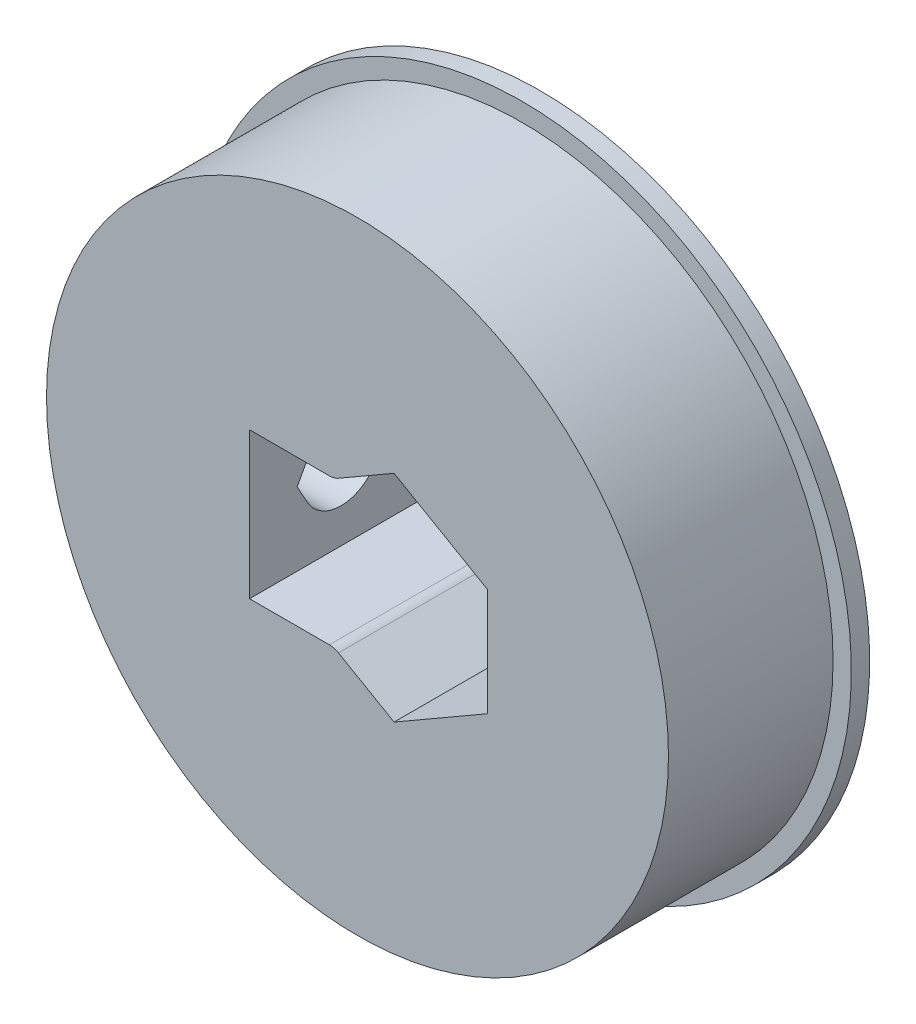
ISO-10303-21;
HEADER;
FILE_DESCRIPTION(('STEP AP214'),'2;1');
FILE_NAME('part.step','',(''),(''),'','','');
FILE_SCHEMA(('AUTOMOTIVE_DESIGN { 1 0 10303 214 1 1 1 1 }'));
ENDSEC;
DATA;
#1=APPLICATION_CONTEXT('core data for automotive mechanical design processes');
#2=APPLICATION_PROTOCOL_DEFINITION('international standard','automotive_design',2000,#1);
#3=PRODUCT_CONTEXT('',#1,'mechanical');
#4=PRODUCT('Part','Part','',(#3));
#5=PRODUCT_RELATED_PRODUCT_CATEGORY('part','',(#4));
#6=PRODUCT_DEFINITION_FORMATION('','',#4);
#7=PRODUCT_DEFINITION_CONTEXT('part definition',#1,'design');
#8=PRODUCT_DEFINITION('design','',#6,#7);
#9=PRODUCT_DEFINITION_SHAPE('','',#8);
#10=(LENGTH_UNIT() NAMED_UNIT(*) SI_UNIT(.MILLI.,.METRE.));
#11=(NAMED_UNIT(*) PLANE_ANGLE_UNIT() SI_UNIT($,.RADIAN.));
#12=(NAMED_UNIT(*) SI_UNIT($,.STERADIAN.) SOLID_ANGLE_UNIT());
#13=UNCERTAINTY_MEASURE_WITH_UNIT(LENGTH_MEASURE(1.E-05),#10,'distance_accuracy_value','');
#14=(GEOMETRIC_REPRESENTATION_CONTEXT(3) GLOBAL_UNCERTAINTY_ASSIGNED_CONTEXT((#13)) GLOBAL_UNIT_ASSIGNED_CONTEXT((#10,
#11,#12)) REPRESENTATION_CONTEXT('',''));
#15=CARTESIAN_POINT('',(0.,0.,0.));
#16=DIRECTION('',(0.,0.,1.));
#17=DIRECTION('',(1.,0.,0.));
#18=AXIS2_PLACEMENT_3D('',#15,#16,#17);
#19=CARTESIAN_POINT('',(-1.,0.,5.));
#20=DIRECTION('',(0.,0.,-1.));
#21=DIRECTION('',(-1.,0.,0.));
#22=AXIS2_PLACEMENT_3D('',#19,#20,#21);
#23=CYLINDRICAL_SURFACE('',#22,8.5);
#24=CARTESIAN_POINT('',(-1.,0.,5.));
#25=DIRECTION('',(0.,0.,1.));
#26=DIRECTION('',(1.,0.,0.));
#27=AXIS2_PLACEMENT_3D('',#24,#25,#26);
#28=CIRCLE('',#27,8.5);
#29=CARTESIAN_POINT('',(7.5,0.,5.));
#30=VERTEX_POINT('',#29);
#31=EDGE_CURVE('E309',#30,#30,#28,.T.);
#32=ORIENTED_EDGE('',*,*,#31,.F.);
#33=EDGE_LOOP('',(#32));
#34=FACE_BOUND('',#33,.T.);
#35=CARTESIAN_POINT('',(-1.,0.,1.3));
#36=DIRECTION('',(0.,0.484122918275927,0.875));
#37=DIRECTION('',(0.,0.875,-0.484122918275928));
#38=AXIS2_PLACEMENT_3D('',#35,#36,#37);
#39=ELLIPSE('',#38,9.71428571428572,8.5);
#40=CARTESIAN_POINT('',(-9.5,0.,1.3));
#41=VERTEX_POINT('',#40);
#42=CARTESIAN_POINT('',(-9.4847864771307,-0.508329064189726,1.58125));
#43=VERTEX_POINT('',#42);
#44=EDGE_CURVE('E204',#41,#43,#39,.T.);
#45=ORIENTED_EDGE('',*,*,#44,.F.);
#46=CARTESIAN_POINT('',(-1.,0.,1.3));
#47=DIRECTION('',(0.,0.484122918275927,-0.875));
#48=DIRECTION('',(0.,-0.875,-0.484122918275927));
#49=AXIS2_PLACEMENT_3D('',#46,#47,#48);
#50=ELLIPSE('',#49,9.71428571428572,8.5);
#51=CARTESIAN_POINT('',(-9.4847864771307,0.508329064189721,1.58125));
#52=VERTEX_POINT('',#51);
#53=EDGE_CURVE('E192',#41,#52,#50,.T.);
#54=ORIENTED_EDGE('',*,*,#53,.T.);
#55=CARTESIAN_POINT('',(-9.4847864771307,0.508329064189721,1.58125));
#56=CARTESIAN_POINT('',(-9.48323574889982,0.534220471547792,1.59557560273147));
#57=CARTESIAN_POINT('',(-9.48160239788813,0.559489731605946,1.61098674043252));
#58=CARTESIAN_POINT('',(-9.47821751741501,0.608632026250239,1.64387958024359));
#59=CARTESIAN_POINT('',(-9.4764659952054,0.632505146345776,1.6613611553467));
#60=CARTESIAN_POINT('',(-9.47110971218724,0.701739189101182,1.71670935831105));
#61=CARTESIAN_POINT('',(-9.46739840078255,0.744791770436927,1.75752216276972));
#62=CARTESIAN_POINT('',(-9.46011441256396,0.823426951914272,1.84580677945868));
#63=CARTESIAN_POINT('',(-9.4565417957666,0.859006346960635,1.8932814343181));
#64=CARTESIAN_POINT('',(-9.44993985578895,0.921689644474573,1.99356009210812));
#65=CARTESIAN_POINT('',(-9.44691041109765,0.948795443550254,2.04636289895667));
#66=CARTESIAN_POINT('',(-9.44174370321231,0.993718957594336,2.15574123956801));
#67=CARTESIAN_POINT('',(-9.43960527328735,1.01154882650044,2.21231172641289));
#68=CARTESIAN_POINT('',(-9.43646074646473,1.03744987980488,2.32768359808633));
#69=CARTESIAN_POINT('',(-9.43545476782663,1.04552004502391,2.38648521524459));
#70=CARTESIAN_POINT('',(-9.43469483729138,1.05163333467233,2.50420850125783));
#71=CARTESIAN_POINT('',(-9.43493232224319,1.04974503771451,2.5631265632005));
#72=CARTESIAN_POINT('',(-9.43661209500547,1.03615740231556,2.67979525706374));
#73=CARTESIAN_POINT('',(-9.43805423823087,1.02445924126989,2.7375460282326));
#74=CARTESIAN_POINT('',(-9.44197482427212,0.99163075137271,2.85014534583484));
#75=CARTESIAN_POINT('',(-9.44445135030286,0.970517863811937,2.90499905003813));
#76=CARTESIAN_POINT('',(-9.45016254588932,0.919461314866445,3.01041271747298));
#77=CARTESIAN_POINT('',(-9.45339749683242,0.889514374844131,3.06097107755741));
#78=CARTESIAN_POINT('',(-9.46028650390169,0.821419157442644,3.15669334096608));
#79=CARTESIAN_POINT('',(-9.46394321981619,0.78321733768192,3.20181888032724));
#80=CARTESIAN_POINT('',(-9.47124506539829,0.699819343125231,3.28499053187817));
#81=CARTESIAN_POINT('',(-9.47489020420562,0.654633620110309,3.3230470388609));
#82=CARTESIAN_POINT('',(-9.47945630976682,0.590824911694526,3.36821852461067));
#83=CARTESIAN_POINT('',(-9.48056507225811,0.574706013783247,3.37897057928987));
#84=CARTESIAN_POINT('',(-9.48272293928692,0.541922770266605,3.39955132478269));
#85=CARTESIAN_POINT('',(-9.48377214002211,0.525259376884247,3.40938152225283));
#86=CARTESIAN_POINT('',(-9.4847864771307,0.508329064189723,3.41875));
#87=B_SPLINE_CURVE_WITH_KNOTS('',3,(#55,#56,#57,#58,#59,#60,#61,#62,#63,#64,#65,#66,#67,#68,#69,
#70,#71,#72,#73,#74,#75,#76,#77,#78,#79,#80,#81,#82,#83,#84,#85,#86),.UNSPECIFIED.,.F.,.F.,(4,2,
2,2,2,2,2,2,2,2,2,2,2,2,2,4),(0.,0.088837681612939,0.177669916472964,0.355073278092299,
0.532552569691333,0.709992108383668,0.887198564756276,1.06442352471965,1.24042963148395,
1.41641461673883,1.5920749260345,1.76780051144732,1.94470205566992,2.1213413759701,
2.17954275377119,2.2376472877351),.UNSPECIFIED.);
#88=CARTESIAN_POINT('',(-9.4847864771307,0.508329064189721,3.41875));
#89=VERTEX_POINT('',#88);
#90=EDGE_CURVE('E203',#52,#89,#87,.T.);
#91=ORIENTED_EDGE('',*,*,#90,.T.);
#92=CARTESIAN_POINT('',(-1.,0.,3.7));
#93=DIRECTION('',(0.,-0.484122918275927,-0.875));
#94=DIRECTION('',(0.,0.875,-0.484122918275927));
#95=AXIS2_PLACEMENT_3D('',#92,#93,#94);
#96=ELLIPSE('',#95,9.71428571428572,8.5);
#97=CARTESIAN_POINT('',(-9.5,0.,3.7));
#98=VERTEX_POINT('',#97);
#99=EDGE_CURVE('E238',#98,#89,#96,.T.);
#100=ORIENTED_EDGE('',*,*,#99,.F.);
#101=CARTESIAN_POINT('',(-1.,0.,3.7));
#102=DIRECTION('',(0.,-0.484122918275927,0.875));
#103=DIRECTION('',(0.,-0.875,-0.484122918275928));
#104=AXIS2_PLACEMENT_3D('',#101,#102,#103);
#105=ELLIPSE('',#104,9.71428571428572,8.5);
#106=CARTESIAN_POINT('',(-9.4847864771307,-0.508329064189726,3.41875));
#107=VERTEX_POINT('',#106);
#108=EDGE_CURVE('E435',#98,#107,#105,.T.);
#109=ORIENTED_EDGE('',*,*,#108,.T.);
#110=CARTESIAN_POINT('',(-9.4847864771307,-0.508329064189726,3.41875));
#111=CARTESIAN_POINT('',(-9.48323574889982,-0.534220471547797,3.40442439726853));
#112=CARTESIAN_POINT('',(-9.48160239788813,-0.559489731605951,3.38901325956748));
#113=CARTESIAN_POINT('',(-9.47821751741502,-0.608632026250244,3.35612041975641));
#114=CARTESIAN_POINT('',(-9.4764659952054,-0.632505146345781,3.33863884465329));
#115=CARTESIAN_POINT('',(-9.47110971218725,-0.701739189101187,3.28329064168895));
#116=CARTESIAN_POINT('',(-9.46739840078255,-0.744791770436932,3.24247783723027));
#117=CARTESIAN_POINT('',(-9.46011441256396,-0.823426951914276,3.15419322054132));
#118=CARTESIAN_POINT('',(-9.4565417957666,-0.85900634696064,3.1067185656819));
#119=CARTESIAN_POINT('',(-9.44993985578895,-0.921689644474577,3.00643990789188));
#120=CARTESIAN_POINT('',(-9.44691041109765,-0.948795443550258,2.95363710104333));
#121=CARTESIAN_POINT('',(-9.44174370321231,-0.99371895759434,2.84425876043199));
#122=CARTESIAN_POINT('',(-9.43960527328735,-1.01154882650045,2.78768827358711));
#123=CARTESIAN_POINT('',(-9.43646074646473,-1.03744987980489,2.67231640191367));
#124=CARTESIAN_POINT('',(-9.43545476782663,-1.04552004502391,2.61351478475541));
#125=CARTESIAN_POINT('',(-9.43469483729138,-1.05163333467233,2.49579149874216));
#126=CARTESIAN_POINT('',(-9.43493232224319,-1.04974503771451,2.4368734367995));
#127=CARTESIAN_POINT('',(-9.43661209500547,-1.03615740231556,2.32020474293626));
#128=CARTESIAN_POINT('',(-9.43805423823087,-1.02445924126989,2.2624539717674));
#129=CARTESIAN_POINT('',(-9.44197482427212,-0.991630751372714,2.14985465416516));
#130=CARTESIAN_POINT('',(-9.44445135030286,-0.970517863811941,2.09500094996186));
#131=CARTESIAN_POINT('',(-9.45016254588932,-0.919461314866448,1.98958728252702));
#132=CARTESIAN_POINT('',(-9.45339749683242,-0.889514374844134,1.93902892244259));
#133=CARTESIAN_POINT('',(-9.46028650390169,-0.821419157442647,1.84330665903392));
#134=CARTESIAN_POINT('',(-9.46394321981619,-0.783217337681923,1.79818111967276));
#135=CARTESIAN_POINT('',(-9.47124506539829,-0.699819343125233,1.71500946812183));
#136=CARTESIAN_POINT('',(-9.47489020420562,-0.654633620110312,1.6769529611391));
#137=CARTESIAN_POINT('',(-9.47945630976682,-0.590824911694529,1.63178147538933));
#138=CARTESIAN_POINT('',(-9.48056507225811,-0.574706013783251,1.62102942071013));
#139=CARTESIAN_POINT('',(-9.48272293928692,-0.54192277026661,1.60044867521731));
#140=CARTESIAN_POINT('',(-9.4837721400221,-0.525259376884252,1.59061847774717));
#141=CARTESIAN_POINT('',(-9.4847864771307,-0.508329064189728,1.58125));
#142=B_SPLINE_CURVE_WITH_KNOTS('',3,(#110,#111,#112,#113,#114,#115,#116,#117,#118,#119,#120,
#121,#122,#123,#124,#125,#126,#127,#128,#129,#130,#131,#132,#133,#134,#135,#136,#137,#138,#139,
#140,#141),.UNSPECIFIED.,.F.,.F.,(4,2,2,2,2,2,2,2,2,2,2,2,2,2,2,4),(0.,0.088837681612939,
0.177669916472964,0.355073278092299,0.532552569691333,0.709992108383669,0.887198564756276,
1.06442352471965,1.24042963148395,1.41641461673883,1.5920749260345,1.76780051144733,
1.94470205566992,2.1213413759701,2.17954275377119,2.23764728773509),.UNSPECIFIED.);
#143=EDGE_CURVE('E216',#107,#43,#142,.T.);
#144=ORIENTED_EDGE('',*,*,#143,.T.);
#145=EDGE_LOOP('',(#45,#54,#91,#100,#109,#144));
#146=FACE_BOUND('',#145,.T.);
#147=CARTESIAN_POINT('',(-1.,0.,0.5));
#148=DIRECTION('',(0.,0.,-1.));
#149=DIRECTION('',(-1.,0.,0.));
#150=AXIS2_PLACEMENT_3D('',#147,#148,#149);
#151=CIRCLE('',#150,8.5);
#152=CARTESIAN_POINT('',(-9.5,0.,0.5));
#153=VERTEX_POINT('',#152);
#154=EDGE_CURVE('E11',#153,#153,#151,.T.);
#155=ORIENTED_EDGE('',*,*,#154,.F.);
#156=EDGE_LOOP('',(#155));
#157=FACE_BOUND('',#156,.T.);
#158=ADVANCED_FACE('F45',(#34,#146,#157),#23,.T.);
#159=CARTESIAN_POINT('',(-1.,0.,5.));
#160=DIRECTION('',(0.,0.,1.));
#161=DIRECTION('',(1.,0.,0.));
#162=AXIS2_PLACEMENT_3D('',#159,#160,#161);
#163=PLANE('',#162);
#164=ORIENTED_EDGE('',*,*,#31,.T.);
#165=EDGE_LOOP('',(#164));
#166=FACE_BOUND('',#165,.T.);
#167=DIRECTION('',(0.866025403784439,-0.5,0.));
#168=VECTOR('',#167,1.);
#169=CARTESIAN_POINT('',(-2.55,-1.47224318643355,5.));
#170=LINE('',#169,#168);
#171=CARTESIAN_POINT('',(-1.5198729810778,-2.06698729810778,5.));
#172=VERTEX_POINT('',#171);
#173=CARTESIAN_POINT('',(0.,-2.94448637286709,5.));
#174=VERTEX_POINT('',#173);
#175=EDGE_CURVE('E375',#172,#174,#170,.T.);
#176=ORIENTED_EDGE('',*,*,#175,.F.);
#177=CARTESIAN_POINT('',(-1.7698729810778,-2.5,5.));
#178=DIRECTION('',(0.,0.,1.));
#179=DIRECTION('',(1.,0.,0.));
#180=AXIS2_PLACEMENT_3D('',#177,#178,#179);
#181=CIRCLE('',#180,0.5);
#182=CARTESIAN_POINT('',(-1.7698729810778,-2.,5.));
#183=VERTEX_POINT('',#182);
#184=EDGE_CURVE('E328',#172,#183,#181,.T.);
#185=ORIENTED_EDGE('',*,*,#184,.T.);
#186=DIRECTION('',(-1.,0.,0.));
#187=VECTOR('',#186,1.);
#188=CARTESIAN_POINT('',(-1.15,-2.,5.));
#189=LINE('',#188,#187);
#190=CARTESIAN_POINT('',(-3.95,-2.,5.));
#191=VERTEX_POINT('',#190);
#192=EDGE_CURVE('E408',#183,#191,#189,.T.);
#193=ORIENTED_EDGE('',*,*,#192,.T.);
#194=DIRECTION('',(0.,-1.,0.));
#195=VECTOR('',#194,1.);
#196=CARTESIAN_POINT('',(-3.95,-2.,5.));
#197=LINE('',#196,#195);
#198=CARTESIAN_POINT('',(-3.95,2.,5.));
#199=VERTEX_POINT('',#198);
#200=EDGE_CURVE('E360',#199,#191,#197,.T.);
#201=ORIENTED_EDGE('',*,*,#200,.F.);
#202=DIRECTION('',(-1.,0.,0.));
#203=VECTOR('',#202,1.);
#204=CARTESIAN_POINT('',(-1.15,2.,5.));
#205=LINE('',#204,#203);
#206=CARTESIAN_POINT('',(-1.76987298107781,2.,5.));
#207=VERTEX_POINT('',#206);
#208=EDGE_CURVE('E349',#207,#199,#205,.T.);
#209=ORIENTED_EDGE('',*,*,#208,.F.);
#210=CARTESIAN_POINT('',(-1.76987298107781,2.5,5.));
#211=DIRECTION('',(0.,0.,1.));
#212=DIRECTION('',(1.,0.,0.));
#213=AXIS2_PLACEMENT_3D('',#210,#211,#212);
#214=CIRCLE('',#213,0.5);
#215=CARTESIAN_POINT('',(-1.51987298107781,2.06698729810778,5.));
#216=VERTEX_POINT('',#215);
#217=EDGE_CURVE('E318',#207,#216,#214,.T.);
#218=ORIENTED_EDGE('',*,*,#217,.T.);
#219=DIRECTION('',(-0.866025403784439,-0.5,0.));
#220=VECTOR('',#219,1.);
#221=CARTESIAN_POINT('',(0.,2.94448637286709,5.));
#222=LINE('',#221,#220);
#223=CARTESIAN_POINT('',(0.,2.94448637286709,5.));
#224=VERTEX_POINT('',#223);
#225=EDGE_CURVE('E370',#224,#216,#222,.T.);
#226=ORIENTED_EDGE('',*,*,#225,.F.);
#227=DIRECTION('',(-0.866025403784439,0.5,0.));
#228=VECTOR('',#227,1.);
#229=CARTESIAN_POINT('',(2.55,1.47224318643355,5.));
#230=LINE('',#229,#228);
#231=CARTESIAN_POINT('',(2.55,1.47224318643355,5.));
#232=VERTEX_POINT('',#231);
#233=EDGE_CURVE('E412',#232,#224,#230,.T.);
#234=ORIENTED_EDGE('',*,*,#233,.F.);
#235=DIRECTION('',(0.,1.,0.));
#236=VECTOR('',#235,1.);
#237=CARTESIAN_POINT('',(2.55,-1.47224318643355,5.));
#238=LINE('',#237,#236);
#239=CARTESIAN_POINT('',(2.55,-1.47224318643355,5.));
#240=VERTEX_POINT('',#239);
#241=EDGE_CURVE('E415',#240,#232,#238,.T.);
#242=ORIENTED_EDGE('',*,*,#241,.F.);
#243=DIRECTION('',(0.866025403784439,0.5,0.));
#244=VECTOR('',#243,1.);
#245=CARTESIAN_POINT('',(0.,-2.94448637286709,5.));
#246=LINE('',#245,#244);
#247=EDGE_CURVE('E378',#174,#240,#246,.T.);
#248=ORIENTED_EDGE('',*,*,#247,.F.);
#249=EDGE_LOOP('',(#176,#185,#193,#201,#209,#218,#226,#234,#242,#248));
#250=FACE_BOUND('',#249,.T.);
#251=ADVANCED_FACE('F295',(#166,#250),#163,.T.);
#252=CARTESIAN_POINT('',(-1.,0.,0.));
#253=DIRECTION('',(0.,0.,1.));
#254=DIRECTION('',(1.,0.,0.));
#255=AXIS2_PLACEMENT_3D('',#252,#253,#254);
#256=PLANE('',#255);
#257=DIRECTION('',(-1.,0.,0.));
#258=VECTOR('',#257,1.);
#259=CARTESIAN_POINT('',(-1.15,-2.,0.));
#260=LINE('',#259,#258);
#261=CARTESIAN_POINT('',(-1.7698729810778,-2.,0.));
#262=VERTEX_POINT('',#261);
#263=CARTESIAN_POINT('',(-3.95,-2.,0.));
#264=VERTEX_POINT('',#263);
#265=EDGE_CURVE('E420',#262,#264,#260,.T.);
#266=ORIENTED_EDGE('',*,*,#265,.F.);
#267=CARTESIAN_POINT('',(-1.7698729810778,-2.5,0.));
#268=DIRECTION('',(0.,0.,1.));
#269=DIRECTION('',(1.,0.,0.));
#270=AXIS2_PLACEMENT_3D('',#267,#268,#269);
#271=CIRCLE('',#270,0.5);
#272=CARTESIAN_POINT('',(-1.5198729810778,-2.06698729810778,0.));
#273=VERTEX_POINT('',#272);
#274=EDGE_CURVE('E337',#262,#273,#271,.F.);
#275=ORIENTED_EDGE('',*,*,#274,.T.);
#276=DIRECTION('',(0.866025403784439,-0.5,0.));
#277=VECTOR('',#276,1.);
#278=CARTESIAN_POINT('',(-2.55,-1.47224318643355,0.));
#279=LINE('',#278,#277);
#280=CARTESIAN_POINT('',(0.,-2.94448637286709,0.));
#281=VERTEX_POINT('',#280);
#282=EDGE_CURVE('E404',#273,#281,#279,.T.);
#283=ORIENTED_EDGE('',*,*,#282,.T.);
#284=DIRECTION('',(0.866025403784439,0.5,0.));
#285=VECTOR('',#284,1.);
#286=CARTESIAN_POINT('',(0.,-2.94448637286709,0.));
#287=LINE('',#286,#285);
#288=CARTESIAN_POINT('',(2.55,-1.47224318643355,0.));
#289=VERTEX_POINT('',#288);
#290=EDGE_CURVE('E398',#281,#289,#287,.T.);
#291=ORIENTED_EDGE('',*,*,#290,.T.);
#292=DIRECTION('',(0.,1.,0.));
#293=VECTOR('',#292,1.);
#294=CARTESIAN_POINT('',(2.55,-1.47224318643355,0.));
#295=LINE('',#294,#293);
#296=CARTESIAN_POINT('',(2.55,1.47224318643355,0.));
#297=VERTEX_POINT('',#296);
#298=EDGE_CURVE('E381',#289,#297,#295,.T.);
#299=ORIENTED_EDGE('',*,*,#298,.T.);
#300=DIRECTION('',(-0.866025403784439,0.5,0.));
#301=VECTOR('',#300,1.);
#302=CARTESIAN_POINT('',(2.55,1.47224318643355,0.));
#303=LINE('',#302,#301);
#304=CARTESIAN_POINT('',(0.,2.94448637286709,0.));
#305=VERTEX_POINT('',#304);
#306=EDGE_CURVE('E373',#297,#305,#303,.T.);
#307=ORIENTED_EDGE('',*,*,#306,.T.);
#308=DIRECTION('',(-0.866025403784439,-0.5,0.));
#309=VECTOR('',#308,1.);
#310=CARTESIAN_POINT('',(0.,2.94448637286709,0.));
#311=LINE('',#310,#309);
#312=CARTESIAN_POINT('',(-1.51987298107781,2.06698729810778,0.));
#313=VERTEX_POINT('',#312);
#314=EDGE_CURVE('E368',#305,#313,#311,.T.);
#315=ORIENTED_EDGE('',*,*,#314,.T.);
#316=CARTESIAN_POINT('',(-1.76987298107781,2.5,0.));
#317=DIRECTION('',(0.,0.,1.));
#318=DIRECTION('',(1.,0.,0.));
#319=AXIS2_PLACEMENT_3D('',#316,#317,#318);
#320=CIRCLE('',#319,0.5);
#321=CARTESIAN_POINT('',(-1.76987298107781,2.,0.));
#322=VERTEX_POINT('',#321);
#323=EDGE_CURVE('E334',#313,#322,#320,.F.);
#324=ORIENTED_EDGE('',*,*,#323,.T.);
#325=DIRECTION('',(-1.,0.,0.));
#326=VECTOR('',#325,1.);
#327=CARTESIAN_POINT('',(-1.15,2.,0.));
#328=LINE('',#327,#326);
#329=CARTESIAN_POINT('',(-3.95,2.,0.));
#330=VERTEX_POINT('',#329);
#331=EDGE_CURVE('E351',#322,#330,#328,.T.);
#332=ORIENTED_EDGE('',*,*,#331,.T.);
#333=DIRECTION('',(0.,1.,0.));
#334=VECTOR('',#333,1.);
#335=CARTESIAN_POINT('',(-3.95,-2.,0.));
#336=LINE('',#335,#334);
#337=EDGE_CURVE('E427',#264,#330,#336,.T.);
#338=ORIENTED_EDGE('',*,*,#337,.F.);
#339=EDGE_LOOP('',(#266,#275,#283,#291,#299,#307,#315,#324,#332,#338));
#340=FACE_BOUND('',#339,.T.);
#341=CARTESIAN_POINT('',(-1.,0.,0.));
#342=DIRECTION('',(0.,0.,-1.));
#343=DIRECTION('',(-1.,0.,0.));
#344=AXIS2_PLACEMENT_3D('',#341,#342,#343);
#345=CIRCLE('',#344,9.);
#346=CARTESIAN_POINT('',(-9.99999999999999,0.,0.));
#347=VERTEX_POINT('',#346);
#348=EDGE_CURVE('E474',#347,#347,#345,.T.);
#349=ORIENTED_EDGE('',*,*,#348,.T.);
#350=EDGE_LOOP('',(#349));
#351=FACE_BOUND('',#350,.T.);
#352=ADVANCED_FACE('F293',(#340,#351),#256,.F.);
#353=CARTESIAN_POINT('',(-2.55,-1.47224318643355,5.));
#354=DIRECTION('',(0.5,0.866025403784439,0.));
#355=DIRECTION('',(-0.866025403784439,0.5,0.));
#356=AXIS2_PLACEMENT_3D('',#353,#354,#355);
#357=PLANE('',#356);
#358=ORIENTED_EDGE('',*,*,#282,.F.);
#359=DIRECTION('',(0.,0.,1.));
#360=VECTOR('',#359,1.);
#361=CARTESIAN_POINT('',(-1.5198729810778,-2.06698729810778,5.));
#362=LINE('',#361,#360);
#363=EDGE_CURVE('E311',#273,#172,#362,.T.);
#364=ORIENTED_EDGE('',*,*,#363,.T.);
#365=ORIENTED_EDGE('',*,*,#175,.T.);
#366=DIRECTION('',(0.,0.,-1.));
#367=VECTOR('',#366,1.);
#368=CARTESIAN_POINT('',(0.,-2.94448637286709,5.));
#369=LINE('',#368,#367);
#370=EDGE_CURVE('E312',#174,#281,#369,.T.);
#371=ORIENTED_EDGE('',*,*,#370,.T.);
#372=EDGE_LOOP('',(#358,#364,#365,#371));
#373=FACE_BOUND('',#372,.T.);
#374=ADVANCED_FACE('F279',(#373),#357,.T.);
#375=CARTESIAN_POINT('',(0.,2.94448637286709,5.));
#376=DIRECTION('',(0.5,-0.866025403784439,0.));
#377=DIRECTION('',(0.866025403784439,0.5,0.));
#378=AXIS2_PLACEMENT_3D('',#375,#376,#377);
#379=PLANE('',#378);
#380=ORIENTED_EDGE('',*,*,#225,.T.);
#381=DIRECTION('',(0.,0.,-1.));
#382=VECTOR('',#381,1.);
#383=CARTESIAN_POINT('',(-1.51987298107781,2.06698729810778,5.));
#384=LINE('',#383,#382);
#385=EDGE_CURVE('E340',#216,#313,#384,.T.);
#386=ORIENTED_EDGE('',*,*,#385,.T.);
#387=ORIENTED_EDGE('',*,*,#314,.F.);
#388=DIRECTION('',(0.,0.,-1.));
#389=VECTOR('',#388,1.);
#390=CARTESIAN_POINT('',(0.,2.94448637286709,5.));
#391=LINE('',#390,#389);
#392=EDGE_CURVE('E385',#224,#305,#391,.T.);
#393=ORIENTED_EDGE('',*,*,#392,.F.);
#394=EDGE_LOOP('',(#380,#386,#387,#393));
#395=FACE_BOUND('',#394,.T.);
#396=ADVANCED_FACE('F275',(#395),#379,.T.);
#397=CARTESIAN_POINT('',(0.,-2.94448637286709,5.));
#398=DIRECTION('',(-0.5,0.866025403784439,0.));
#399=DIRECTION('',(-0.866025403784439,-0.5,0.));
#400=AXIS2_PLACEMENT_3D('',#397,#398,#399);
#401=PLANE('',#400);
#402=ORIENTED_EDGE('',*,*,#290,.F.);
#403=ORIENTED_EDGE('',*,*,#370,.F.);
#404=ORIENTED_EDGE('',*,*,#247,.T.);
#405=DIRECTION('',(0.,0.,-1.));
#406=VECTOR('',#405,1.);
#407=CARTESIAN_POINT('',(2.55,-1.47224318643355,5.));
#408=LINE('',#407,#406);
#409=EDGE_CURVE('E322',#240,#289,#408,.T.);
#410=ORIENTED_EDGE('',*,*,#409,.T.);
#411=EDGE_LOOP('',(#402,#403,#404,#410));
#412=FACE_BOUND('',#411,.T.);
#413=ADVANCED_FACE('F278',(#412),#401,.T.);
#414=CARTESIAN_POINT('',(2.55,-1.47224318643355,5.));
#415=DIRECTION('',(-1.,0.,0.));
#416=DIRECTION('',(0.,0.,1.));
#417=AXIS2_PLACEMENT_3D('',#414,#415,#416);
#418=PLANE('',#417);
#419=ORIENTED_EDGE('',*,*,#298,.F.);
#420=ORIENTED_EDGE('',*,*,#409,.F.);
#421=ORIENTED_EDGE('',*,*,#241,.T.);
#422=DIRECTION('',(0.,0.,-1.));
#423=VECTOR('',#422,1.);
#424=CARTESIAN_POINT('',(2.55,1.47224318643355,5.));
#425=LINE('',#424,#423);
#426=EDGE_CURVE('E388',#232,#297,#425,.T.);
#427=ORIENTED_EDGE('',*,*,#426,.T.);
#428=EDGE_LOOP('',(#419,#420,#421,#427));
#429=FACE_BOUND('',#428,.T.);
#430=ADVANCED_FACE('F283',(#429),#418,.T.);
#431=CARTESIAN_POINT('',(2.55,1.47224318643355,5.));
#432=DIRECTION('',(-0.5,-0.866025403784439,0.));
#433=DIRECTION('',(0.866025403784439,-0.5,0.));
#434=AXIS2_PLACEMENT_3D('',#431,#432,#433);
#435=PLANE('',#434);
#436=ORIENTED_EDGE('',*,*,#306,.F.);
#437=ORIENTED_EDGE('',*,*,#426,.F.);
#438=ORIENTED_EDGE('',*,*,#233,.T.);
#439=ORIENTED_EDGE('',*,*,#392,.T.);
#440=EDGE_LOOP('',(#436,#437,#438,#439));
#441=FACE_BOUND('',#440,.T.);
#442=ADVANCED_FACE('F273',(#441),#435,.T.);
#443=CARTESIAN_POINT('',(-1.15,-2.,0.));
#444=DIRECTION('',(0.,1.,0.));
#445=DIRECTION('',(-1.,0.,0.));
#446=AXIS2_PLACEMENT_3D('',#443,#444,#445);
#447=PLANE('',#446);
#448=ORIENTED_EDGE('',*,*,#192,.F.);
#449=DIRECTION('',(0.,0.,1.));
#450=VECTOR('',#449,1.);
#451=CARTESIAN_POINT('',(-1.7698729810778,-2.,0.));
#452=LINE('',#451,#450);
#453=EDGE_CURVE('E331',#183,#262,#452,.F.);
#454=ORIENTED_EDGE('',*,*,#453,.T.);
#455=ORIENTED_EDGE('',*,*,#265,.T.);
#456=DIRECTION('',(0.,0.,-1.));
#457=VECTOR('',#456,1.);
#458=CARTESIAN_POINT('',(-3.95,-2.,0.));
#459=LINE('',#458,#457);
#460=EDGE_CURVE('E430',#191,#264,#459,.T.);
#461=ORIENTED_EDGE('',*,*,#460,.F.);
#462=EDGE_LOOP('',(#448,#454,#455,#461));
#463=FACE_BOUND('',#462,.T.);
#464=ADVANCED_FACE('F269',(#463),#447,.T.);
#465=CARTESIAN_POINT('',(-1.15,2.,0.));
#466=DIRECTION('',(0.,-1.,0.));
#467=DIRECTION('',(1.,0.,0.));
#468=AXIS2_PLACEMENT_3D('',#465,#466,#467);
#469=PLANE('',#468);
#470=ORIENTED_EDGE('',*,*,#331,.F.);
#471=DIRECTION('',(0.,0.,-1.));
#472=VECTOR('',#471,1.);
#473=CARTESIAN_POINT('',(-1.76987298107781,2.,0.));
#474=LINE('',#473,#472);
#475=EDGE_CURVE('E54',#322,#207,#474,.F.);
#476=ORIENTED_EDGE('',*,*,#475,.T.);
#477=ORIENTED_EDGE('',*,*,#208,.T.);
#478=DIRECTION('',(0.,0.,1.));
#479=VECTOR('',#478,1.);
#480=CARTESIAN_POINT('',(-3.95,2.,0.));
#481=LINE('',#480,#479);
#482=EDGE_CURVE('E362',#330,#199,#481,.T.);
#483=ORIENTED_EDGE('',*,*,#482,.F.);
#484=EDGE_LOOP('',(#470,#476,#477,#483));
#485=FACE_BOUND('',#484,.T.);
#486=ADVANCED_FACE('F265',(#485),#469,.T.);
#487=CARTESIAN_POINT('',(-3.95,0.,0.));
#488=DIRECTION('',(1.,0.,0.));
#489=DIRECTION('',(0.,1.,0.));
#490=AXIS2_PLACEMENT_3D('',#487,#488,#489);
#491=PLANE('',#490);
#492=DIRECTION('',(0.,-0.875,-0.484122918275928));
#493=VECTOR('',#492,1.);
#494=CARTESIAN_POINT('',(-3.95,-1.56734794791832,2.8328125));
#495=LINE('',#494,#493);
#496=CARTESIAN_POINT('',(-3.95,0.,3.7));
#497=VERTEX_POINT('',#496);
#498=CARTESIAN_POINT('',(-3.95,-0.508329064189725,3.41875));
#499=VERTEX_POINT('',#498);
#500=EDGE_CURVE('E75',#497,#499,#495,.T.);
#501=ORIENTED_EDGE('',*,*,#500,.F.);
#502=DIRECTION('',(0.,0.875,-0.484122918275927));
#503=VECTOR('',#502,1.);
#504=CARTESIAN_POINT('',(-3.95,1.56734794791831,2.8328125));
#505=LINE('',#504,#503);
#506=CARTESIAN_POINT('',(-3.95,0.508329064189722,3.41875));
#507=VERTEX_POINT('',#506);
#508=EDGE_CURVE('E457',#497,#507,#505,.T.);
#509=ORIENTED_EDGE('',*,*,#508,.T.);
#510=CARTESIAN_POINT('',(-3.95,0.,2.5));
#511=DIRECTION('',(1.,0.,0.));
#512=DIRECTION('',(0.,1.,0.));
#513=AXIS2_PLACEMENT_3D('',#510,#511,#512);
#514=CIRCLE('',#513,1.05);
#515=CARTESIAN_POINT('',(-3.95,0.508329064189722,1.58125));
#516=VERTEX_POINT('',#515);
#517=EDGE_CURVE('E448',#516,#507,#514,.T.);
#518=ORIENTED_EDGE('',*,*,#517,.F.);
#519=DIRECTION('',(0.,0.875,0.484122918275927));
#520=VECTOR('',#519,1.);
#521=CARTESIAN_POINT('',(-3.95,-0.550689819538868,0.9953125));
#522=LINE('',#521,#520);
#523=CARTESIAN_POINT('',(-3.95,0.,1.3));
#524=VERTEX_POINT('',#523);
#525=EDGE_CURVE('E462',#524,#516,#522,.T.);
#526=ORIENTED_EDGE('',*,*,#525,.F.);
#527=DIRECTION('',(0.,-0.875,0.484122918275928));
#528=VECTOR('',#527,1.);
#529=CARTESIAN_POINT('',(-3.95,0.550689819538867,0.995312499999999));
#530=LINE('',#529,#528);
#531=CARTESIAN_POINT('',(-3.95,-0.508329064189725,1.58125));
#532=VERTEX_POINT('',#531);
#533=EDGE_CURVE('E210',#524,#532,#530,.T.);
#534=ORIENTED_EDGE('',*,*,#533,.T.);
#535=CARTESIAN_POINT('',(-3.95,0.,2.5));
#536=DIRECTION('',(1.,0.,0.));
#537=DIRECTION('',(0.,1.,0.));
#538=AXIS2_PLACEMENT_3D('',#535,#536,#537);
#539=CIRCLE('',#538,1.05);
#540=EDGE_CURVE('E469',#499,#532,#539,.T.);
#541=ORIENTED_EDGE('',*,*,#540,.F.);
#542=EDGE_LOOP('',(#501,#509,#518,#526,#534,#541));
#543=FACE_BOUND('',#542,.T.);
#544=ORIENTED_EDGE('',*,*,#200,.T.);
#545=ORIENTED_EDGE('',*,*,#460,.T.);
#546=ORIENTED_EDGE('',*,*,#337,.T.);
#547=ORIENTED_EDGE('',*,*,#482,.T.);
#548=EDGE_LOOP('',(#544,#545,#546,#547));
#549=FACE_BOUND('',#548,.T.);
#550=ADVANCED_FACE('F261',(#543,#549),#491,.T.);
#551=CARTESIAN_POINT('',(-1.7698729810778,-2.5,5.));
#552=DIRECTION('',(0.,0.,1.));
#553=DIRECTION('',(1.,0.,0.));
#554=AXIS2_PLACEMENT_3D('',#551,#552,#553);
#555=CYLINDRICAL_SURFACE('',#554,0.5);
#556=ORIENTED_EDGE('',*,*,#274,.F.);
#557=ORIENTED_EDGE('',*,*,#453,.F.);
#558=ORIENTED_EDGE('',*,*,#184,.F.);
#559=ORIENTED_EDGE('',*,*,#363,.F.);
#560=EDGE_LOOP('',(#556,#557,#558,#559));
#561=FACE_BOUND('',#560,.T.);
#562=ADVANCED_FACE('F264',(#561),#555,.T.);
#563=CARTESIAN_POINT('',(-1.76987298107781,2.5,5.));
#564=DIRECTION('',(0.,0.,-1.));
#565=DIRECTION('',(-1.,0.,0.));
#566=AXIS2_PLACEMENT_3D('',#563,#564,#565);
#567=CYLINDRICAL_SURFACE('',#566,0.5);
#568=ORIENTED_EDGE('',*,*,#217,.F.);
#569=ORIENTED_EDGE('',*,*,#475,.F.);
#570=ORIENTED_EDGE('',*,*,#323,.F.);
#571=ORIENTED_EDGE('',*,*,#385,.F.);
#572=EDGE_LOOP('',(#568,#569,#570,#571));
#573=FACE_BOUND('',#572,.T.);
#574=ADVANCED_FACE('F47',(#573),#567,.T.);
#575=CARTESIAN_POINT('',(-9.5,-1.56734794791832,2.8328125));
#576=DIRECTION('',(0.,-0.484122918275927,0.875));
#577=DIRECTION('',(0.,-0.875,-0.484122918275928));
#578=AXIS2_PLACEMENT_3D('',#575,#576,#577);
#579=PLANE('',#578);
#580=DIRECTION('',(1.,0.,0.));
#581=VECTOR('',#580,1.);
#582=CARTESIAN_POINT('',(-9.5,0.,3.7));
#583=LINE('',#582,#581);
#584=EDGE_CURVE('E222',#98,#497,#583,.T.);
#585=ORIENTED_EDGE('',*,*,#584,.T.);
#586=ORIENTED_EDGE('',*,*,#500,.T.);
#587=DIRECTION('',(1.,0.,0.));
#588=VECTOR('',#587,1.);
#589=CARTESIAN_POINT('',(-9.5,-0.508329064189726,3.41875));
#590=LINE('',#589,#588);
#591=EDGE_CURVE('E456',#107,#499,#590,.T.);
#592=ORIENTED_EDGE('',*,*,#591,.F.);
#593=ORIENTED_EDGE('',*,*,#108,.F.);
#594=EDGE_LOOP('',(#585,#586,#592,#593));
#595=FACE_BOUND('',#594,.T.);
#596=ADVANCED_FACE('F258',(#595),#579,.F.);
#597=CARTESIAN_POINT('',(-9.5,1.56734794791831,2.8328125));
#598=DIRECTION('',(0.,-0.484122918275927,-0.875));
#599=DIRECTION('',(0.,0.875,-0.484122918275927));
#600=AXIS2_PLACEMENT_3D('',#597,#598,#599);
#601=PLANE('',#600);
#602=ORIENTED_EDGE('',*,*,#99,.T.);
#603=DIRECTION('',(1.,0.,0.));
#604=VECTOR('',#603,1.);
#605=CARTESIAN_POINT('',(-9.5,0.508329064189721,3.41875));
#606=LINE('',#605,#604);
#607=EDGE_CURVE('E445',#89,#507,#606,.T.);
#608=ORIENTED_EDGE('',*,*,#607,.T.);
#609=ORIENTED_EDGE('',*,*,#508,.F.);
#610=ORIENTED_EDGE('',*,*,#584,.F.);
#611=EDGE_LOOP('',(#602,#608,#609,#610));
#612=FACE_BOUND('',#611,.T.);
#613=ADVANCED_FACE('F247',(#612),#601,.T.);
#614=CARTESIAN_POINT('',(-9.5,0.,2.5));
#615=DIRECTION('',(1.,0.,0.));
#616=DIRECTION('',(0.,1.,0.));
#617=AXIS2_PLACEMENT_3D('',#614,#615,#616);
#618=CYLINDRICAL_SURFACE('',#617,1.05);
#619=DIRECTION('',(1.,0.,0.));
#620=VECTOR('',#619,1.);
#621=CARTESIAN_POINT('',(-9.5,0.508329064189721,1.58125));
#622=LINE('',#621,#620);
#623=EDGE_CURVE('E198',#52,#516,#622,.T.);
#624=ORIENTED_EDGE('',*,*,#623,.T.);
#625=ORIENTED_EDGE('',*,*,#517,.T.);
#626=ORIENTED_EDGE('',*,*,#607,.F.);
#627=ORIENTED_EDGE('',*,*,#90,.F.);
#628=EDGE_LOOP('',(#624,#625,#626,#627));
#629=FACE_BOUND('',#628,.T.);
#630=ADVANCED_FACE('F242',(#629),#618,.F.);
#631=CARTESIAN_POINT('',(-9.5,-0.550689819538869,0.9953125));
#632=DIRECTION('',(0.,0.484122918275927,-0.875));
#633=DIRECTION('',(0.,0.875,0.484122918275927));
#634=AXIS2_PLACEMENT_3D('',#631,#632,#633);
#635=PLANE('',#634);
#636=DIRECTION('',(1.,0.,0.));
#637=VECTOR('',#636,1.);
#638=CARTESIAN_POINT('',(-9.5,0.,1.3));
#639=LINE('',#638,#637);
#640=EDGE_CURVE('E196',#41,#524,#639,.T.);
#641=ORIENTED_EDGE('',*,*,#640,.T.);
#642=ORIENTED_EDGE('',*,*,#525,.T.);
#643=ORIENTED_EDGE('',*,*,#623,.F.);
#644=ORIENTED_EDGE('',*,*,#53,.F.);
#645=EDGE_LOOP('',(#641,#642,#643,#644));
#646=FACE_BOUND('',#645,.T.);
#647=ADVANCED_FACE('F194',(#646),#635,.F.);
#648=CARTESIAN_POINT('',(-9.5,0.550689819538866,0.995312499999999));
#649=DIRECTION('',(0.,0.484122918275927,0.875));
#650=DIRECTION('',(0.,-0.875,0.484122918275928));
#651=AXIS2_PLACEMENT_3D('',#648,#649,#650);
#652=PLANE('',#651);
#653=ORIENTED_EDGE('',*,*,#44,.T.);
#654=DIRECTION('',(1.,0.,0.));
#655=VECTOR('',#654,1.);
#656=CARTESIAN_POINT('',(-9.5,-0.508329064189726,1.58125));
#657=LINE('',#656,#655);
#658=EDGE_CURVE('E64',#43,#532,#657,.T.);
#659=ORIENTED_EDGE('',*,*,#658,.T.);
#660=ORIENTED_EDGE('',*,*,#533,.F.);
#661=ORIENTED_EDGE('',*,*,#640,.F.);
#662=EDGE_LOOP('',(#653,#659,#660,#661));
#663=FACE_BOUND('',#662,.T.);
#664=ADVANCED_FACE('F207',(#663),#652,.T.);
#665=CARTESIAN_POINT('',(-9.5,0.,2.5));
#666=DIRECTION('',(1.,0.,0.));
#667=DIRECTION('',(0.,1.,0.));
#668=AXIS2_PLACEMENT_3D('',#665,#666,#667);
#669=CYLINDRICAL_SURFACE('',#668,1.05);
#670=ORIENTED_EDGE('',*,*,#591,.T.);
#671=ORIENTED_EDGE('',*,*,#540,.T.);
#672=ORIENTED_EDGE('',*,*,#658,.F.);
#673=ORIENTED_EDGE('',*,*,#143,.F.);
#674=EDGE_LOOP('',(#670,#671,#672,#673));
#675=FACE_BOUND('',#674,.T.);
#676=ADVANCED_FACE('F253',(#675),#669,.F.);
#677=CARTESIAN_POINT('',(-1.,0.,0.5));
#678=DIRECTION('',(0.,0.,-1.));
#679=DIRECTION('',(-1.,0.,0.));
#680=AXIS2_PLACEMENT_3D('',#677,#678,#679);
#681=CYLINDRICAL_SURFACE('',#680,9.);
#682=CARTESIAN_POINT('',(-1.,0.,0.5));
#683=DIRECTION('',(0.,0.,-1.));
#684=DIRECTION('',(-1.,0.,0.));
#685=AXIS2_PLACEMENT_3D('',#682,#683,#684);
#686=CIRCLE('',#685,9.);
#687=CARTESIAN_POINT('',(-9.99999999999999,0.,0.5));
#688=VERTEX_POINT('',#687);
#689=EDGE_CURVE('E473',#688,#688,#686,.T.);
#690=ORIENTED_EDGE('',*,*,#689,.T.);
#691=EDGE_LOOP('',(#690));
#692=FACE_BOUND('',#691,.T.);
#693=ORIENTED_EDGE('',*,*,#348,.F.);
#694=EDGE_LOOP('',(#693));
#695=FACE_BOUND('',#694,.T.);
#696=ADVANCED_FACE('F257',(#692,#695),#681,.T.);
#697=CARTESIAN_POINT('',(-1.,0.,0.5));
#698=DIRECTION('',(0.,0.,-1.));
#699=DIRECTION('',(-1.,0.,0.));
#700=AXIS2_PLACEMENT_3D('',#697,#698,#699);
#701=PLANE('',#700);
#702=ORIENTED_EDGE('',*,*,#154,.T.);
#703=EDGE_LOOP('',(#702));
#704=FACE_BOUND('',#703,.T.);
#705=ORIENTED_EDGE('',*,*,#689,.F.);
#706=EDGE_LOOP('',(#705));
#707=FACE_BOUND('',#706,.T.);
#708=ADVANCED_FACE('F484',(#704,#707),#701,.F.);
#709=CLOSED_SHELL('',(#158,#251,#352,#374,#396,#413,#430,#442,#464,#486,#550,#562,#574,#596,
#613,#630,#647,#664,#676,#696,#708));
#710=MANIFOLD_SOLID_BREP('B2',#709);
#711=ADVANCED_BREP_SHAPE_REPRESENTATION('',(#18,#710),#14);
#712=SHAPE_DEFINITION_REPRESENTATION(#9,#711);
ENDSEC;
END-ISO-10303-21;
